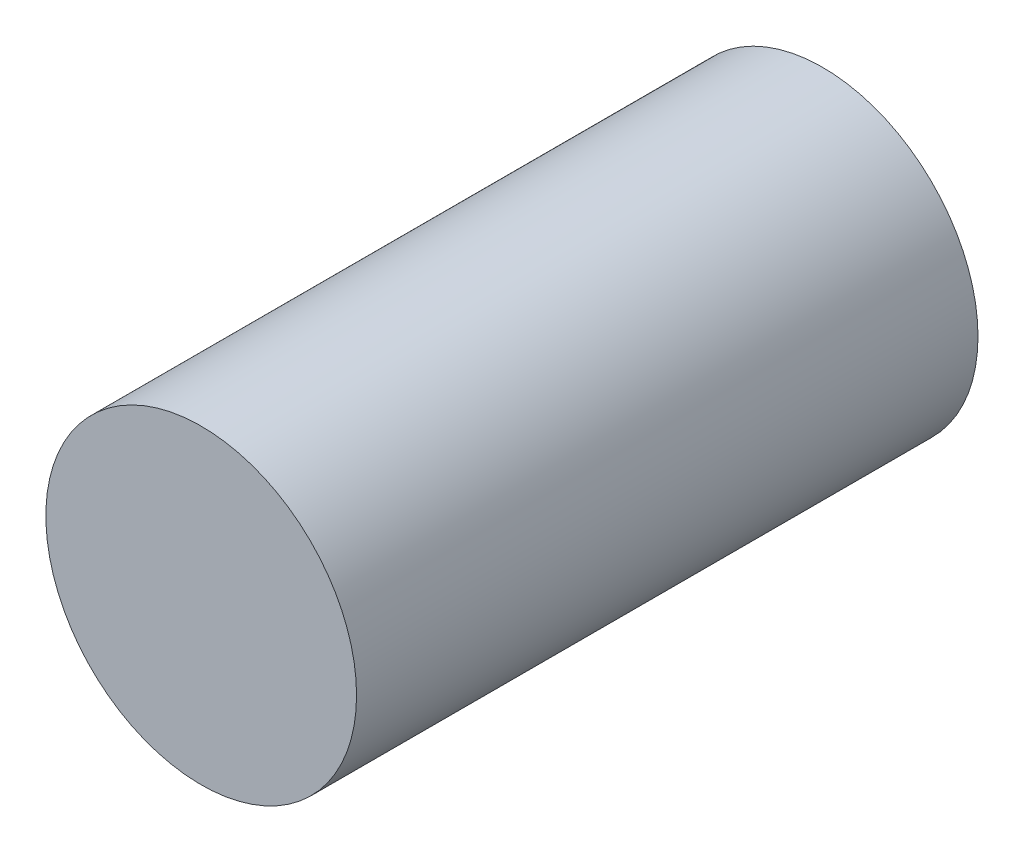
ISO-10303-21;
HEADER;
FILE_DESCRIPTION(('STEP AP214'),'2;1');
FILE_NAME('part.step','',(''),(''),'','','');
FILE_SCHEMA(('AUTOMOTIVE_DESIGN { 1 0 10303 214 1 1 1 1 }'));
ENDSEC;
DATA;
#1=APPLICATION_CONTEXT('core data for automotive mechanical design processes');
#2=APPLICATION_PROTOCOL_DEFINITION('international standard','automotive_design',2000,#1);
#3=PRODUCT_CONTEXT('',#1,'mechanical');
#4=PRODUCT('Part','Part','',(#3));
#5=PRODUCT_RELATED_PRODUCT_CATEGORY('part','',(#4));
#6=PRODUCT_DEFINITION_FORMATION('','',#4);
#7=PRODUCT_DEFINITION_CONTEXT('part definition',#1,'design');
#8=PRODUCT_DEFINITION('design','',#6,#7);
#9=PRODUCT_DEFINITION_SHAPE('','',#8);
#10=(LENGTH_UNIT() NAMED_UNIT(*) SI_UNIT(.MILLI.,.METRE.));
#11=(NAMED_UNIT(*) PLANE_ANGLE_UNIT() SI_UNIT($,.RADIAN.));
#12=(NAMED_UNIT(*) SI_UNIT($,.STERADIAN.) SOLID_ANGLE_UNIT());
#13=UNCERTAINTY_MEASURE_WITH_UNIT(LENGTH_MEASURE(1.E-05),#10,'distance_accuracy_value','');
#14=(GEOMETRIC_REPRESENTATION_CONTEXT(3) GLOBAL_UNCERTAINTY_ASSIGNED_CONTEXT((#13)) GLOBAL_UNIT_ASSIGNED_CONTEXT((#10,
#11,#12)) REPRESENTATION_CONTEXT('',''));
#15=CARTESIAN_POINT('',(0.,0.,0.));
#16=DIRECTION('',(0.,0.,1.));
#17=DIRECTION('',(1.,0.,0.));
#18=AXIS2_PLACEMENT_3D('',#15,#16,#17);
#19=CARTESIAN_POINT('',(0.,0.,100.));
#20=DIRECTION('',(0.,0.,-1.));
#21=DIRECTION('',(-1.,0.,0.));
#22=AXIS2_PLACEMENT_3D('',#19,#20,#21);
#23=CYLINDRICAL_SURFACE('',#22,25.);
#24=CARTESIAN_POINT('',(0.,0.,100.));
#25=DIRECTION('',(0.,0.,1.));
#26=DIRECTION('',(1.,0.,0.));
#27=AXIS2_PLACEMENT_3D('',#24,#25,#26);
#28=CIRCLE('',#27,25.);
#29=CARTESIAN_POINT('',(25.,0.,100.));
#30=VERTEX_POINT('',#29);
#31=EDGE_CURVE('E10',#30,#30,#28,.T.);
#32=ORIENTED_EDGE('',*,*,#31,.F.);
#33=EDGE_LOOP('',(#32));
#34=FACE_BOUND('',#33,.T.);
#35=CARTESIAN_POINT('',(0.,0.,0.));
#36=DIRECTION('',(0.,0.,1.));
#37=DIRECTION('',(1.,0.,0.));
#38=AXIS2_PLACEMENT_3D('',#35,#36,#37);
#39=CIRCLE('',#38,25.);
#40=CARTESIAN_POINT('',(25.,0.,0.));
#41=VERTEX_POINT('',#40);
#42=EDGE_CURVE('E33',#41,#41,#39,.T.);
#43=ORIENTED_EDGE('',*,*,#42,.T.);
#44=EDGE_LOOP('',(#43));
#45=FACE_BOUND('',#44,.T.);
#46=ADVANCED_FACE('F30',(#34,#45),#23,.T.);
#47=CARTESIAN_POINT('',(0.,0.,100.));
#48=DIRECTION('',(0.,0.,1.));
#49=DIRECTION('',(1.,0.,0.));
#50=AXIS2_PLACEMENT_3D('',#47,#48,#49);
#51=PLANE('',#50);
#52=ORIENTED_EDGE('',*,*,#31,.T.);
#53=EDGE_LOOP('',(#52));
#54=FACE_BOUND('',#53,.T.);
#55=ADVANCED_FACE('F45',(#54),#51,.T.);
#56=CARTESIAN_POINT('',(0.,0.,0.));
#57=DIRECTION('',(0.,0.,1.));
#58=DIRECTION('',(1.,0.,0.));
#59=AXIS2_PLACEMENT_3D('',#56,#57,#58);
#60=PLANE('',#59);
#61=ORIENTED_EDGE('',*,*,#42,.F.);
#62=EDGE_LOOP('',(#61));
#63=FACE_BOUND('',#62,.T.);
#64=ADVANCED_FACE('F43',(#63),#60,.F.);
#65=CLOSED_SHELL('',(#46,#55,#64));
#66=MANIFOLD_SOLID_BREP('B2',#65);
#67=ADVANCED_BREP_SHAPE_REPRESENTATION('',(#18,#66),#14);
#68=SHAPE_DEFINITION_REPRESENTATION(#9,#67);
ENDSEC;
END-ISO-10303-21;
